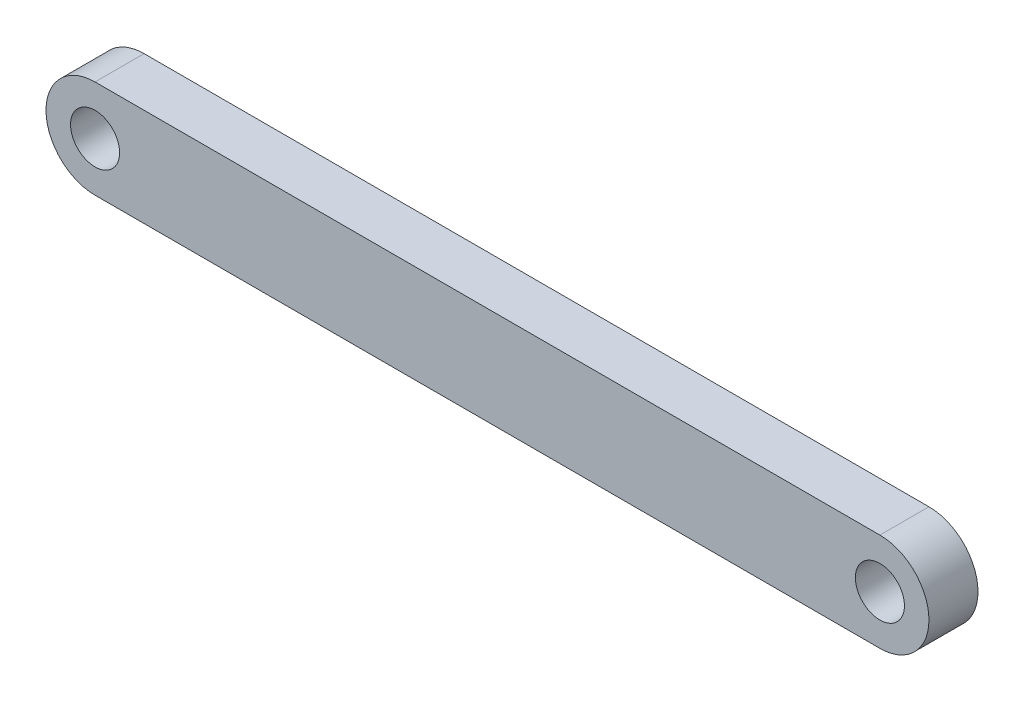
ISO-10303-21;
HEADER;
FILE_DESCRIPTION(('STEP AP214'),'2;1');
FILE_NAME('part.step','',(''),(''),'','','');
FILE_SCHEMA(('AUTOMOTIVE_DESIGN { 1 0 10303 214 1 1 1 1 }'));
ENDSEC;
DATA;
#1=APPLICATION_CONTEXT('core data for automotive mechanical design processes');
#2=APPLICATION_PROTOCOL_DEFINITION('international standard','automotive_design',2000,#1);
#3=PRODUCT_CONTEXT('',#1,'mechanical');
#4=PRODUCT('Part','Part','',(#3));
#5=PRODUCT_RELATED_PRODUCT_CATEGORY('part','',(#4));
#6=PRODUCT_DEFINITION_FORMATION('','',#4);
#7=PRODUCT_DEFINITION_CONTEXT('part definition',#1,'design');
#8=PRODUCT_DEFINITION('design','',#6,#7);
#9=PRODUCT_DEFINITION_SHAPE('','',#8);
#10=(LENGTH_UNIT() NAMED_UNIT(*) SI_UNIT(.MILLI.,.METRE.));
#11=(NAMED_UNIT(*) PLANE_ANGLE_UNIT() SI_UNIT($,.RADIAN.));
#12=(NAMED_UNIT(*) SI_UNIT($,.STERADIAN.) SOLID_ANGLE_UNIT());
#13=UNCERTAINTY_MEASURE_WITH_UNIT(LENGTH_MEASURE(1.E-05),#10,'distance_accuracy_value','');
#14=(GEOMETRIC_REPRESENTATION_CONTEXT(3) GLOBAL_UNCERTAINTY_ASSIGNED_CONTEXT((#13)) GLOBAL_UNIT_ASSIGNED_CONTEXT((#10,
#11,#12)) REPRESENTATION_CONTEXT('',''));
#15=CARTESIAN_POINT('',(0.,0.,0.));
#16=DIRECTION('',(0.,0.,1.));
#17=DIRECTION('',(1.,0.,0.));
#18=AXIS2_PLACEMENT_3D('',#15,#16,#17);
#19=CARTESIAN_POINT('',(-47.9644500235423,0.,5.));
#20=DIRECTION('',(0.,0.,1.));
#21=DIRECTION('',(1.,0.,0.));
#22=AXIS2_PLACEMENT_3D('',#19,#20,#21);
#23=PLANE('',#22);
#24=CARTESIAN_POINT('',(-47.9644500235423,0.,5.));
#25=DIRECTION('',(0.,0.,1.));
#26=DIRECTION('',(1.,0.,0.));
#27=AXIS2_PLACEMENT_3D('',#24,#25,#26);
#28=CIRCLE('',#27,2.5);
#29=CARTESIAN_POINT('',(-45.4644500235423,0.,5.));
#30=VERTEX_POINT('',#29);
#31=EDGE_CURVE('E112',#30,#30,#28,.T.);
#32=ORIENTED_EDGE('',*,*,#31,.F.);
#33=EDGE_LOOP('',(#32));
#34=FACE_BOUND('',#33,.T.);
#35=CARTESIAN_POINT('',(-47.9644500235423,0.,5.));
#36=DIRECTION('',(0.,0.,1.));
#37=DIRECTION('',(1.,0.,0.));
#38=AXIS2_PLACEMENT_3D('',#35,#36,#37);
#39=CIRCLE('',#38,5.);
#40=CARTESIAN_POINT('',(-47.9644500235423,5.,5.));
#41=VERTEX_POINT('',#40);
#42=CARTESIAN_POINT('',(-47.9644500235423,-5.,5.));
#43=VERTEX_POINT('',#42);
#44=EDGE_CURVE('E92',#41,#43,#39,.T.);
#45=ORIENTED_EDGE('',*,*,#44,.T.);
#46=DIRECTION('',(1.,0.,0.));
#47=VECTOR('',#46,1.);
#48=CARTESIAN_POINT('',(-47.9644500235423,-5.,5.));
#49=LINE('',#48,#47);
#50=CARTESIAN_POINT('',(32.0355499764577,-5.,5.));
#51=VERTEX_POINT('',#50);
#52=EDGE_CURVE('E87',#43,#51,#49,.T.);
#53=ORIENTED_EDGE('',*,*,#52,.T.);
#54=CARTESIAN_POINT('',(32.0355499764577,0.,5.));
#55=DIRECTION('',(0.,0.,1.));
#56=DIRECTION('',(1.,0.,0.));
#57=AXIS2_PLACEMENT_3D('',#54,#55,#56);
#58=CIRCLE('',#57,5.);
#59=CARTESIAN_POINT('',(32.0355499764577,5.,5.));
#60=VERTEX_POINT('',#59);
#61=EDGE_CURVE('E90',#51,#60,#58,.T.);
#62=ORIENTED_EDGE('',*,*,#61,.T.);
#63=DIRECTION('',(-1.,0.,0.));
#64=VECTOR('',#63,1.);
#65=CARTESIAN_POINT('',(-47.9644500235423,5.,5.));
#66=LINE('',#65,#64);
#67=EDGE_CURVE('E57',#60,#41,#66,.T.);
#68=ORIENTED_EDGE('',*,*,#67,.T.);
#69=EDGE_LOOP('',(#45,#53,#62,#68));
#70=FACE_BOUND('',#69,.T.);
#71=CARTESIAN_POINT('',(32.0355499764577,0.,5.));
#72=DIRECTION('',(0.,0.,1.));
#73=DIRECTION('',(1.,0.,0.));
#74=AXIS2_PLACEMENT_3D('',#71,#72,#73);
#75=CIRCLE('',#74,2.5);
#76=CARTESIAN_POINT('',(34.5355499764577,0.,5.));
#77=VERTEX_POINT('',#76);
#78=EDGE_CURVE('E134',#77,#77,#75,.T.);
#79=ORIENTED_EDGE('',*,*,#78,.F.);
#80=EDGE_LOOP('',(#79));
#81=FACE_BOUND('',#80,.T.);
#82=ADVANCED_FACE('F39',(#34,#70,#81),#23,.T.);
#83=CARTESIAN_POINT('',(-47.9644500235423,0.,0.));
#84=DIRECTION('',(0.,0.,1.));
#85=DIRECTION('',(1.,0.,0.));
#86=AXIS2_PLACEMENT_3D('',#83,#84,#85);
#87=PLANE('',#86);
#88=CARTESIAN_POINT('',(-47.9644500235423,0.,0.));
#89=DIRECTION('',(0.,0.,1.));
#90=DIRECTION('',(1.,0.,0.));
#91=AXIS2_PLACEMENT_3D('',#88,#89,#90);
#92=CIRCLE('',#91,5.);
#93=CARTESIAN_POINT('',(-47.9644500235423,5.,0.));
#94=VERTEX_POINT('',#93);
#95=CARTESIAN_POINT('',(-47.9644500235423,-5.,0.));
#96=VERTEX_POINT('',#95);
#97=EDGE_CURVE('E108',#94,#96,#92,.T.);
#98=ORIENTED_EDGE('',*,*,#97,.F.);
#99=DIRECTION('',(-1.,0.,0.));
#100=VECTOR('',#99,1.);
#101=CARTESIAN_POINT('',(-47.9644500235423,5.,0.));
#102=LINE('',#101,#100);
#103=CARTESIAN_POINT('',(32.0355499764577,5.,0.));
#104=VERTEX_POINT('',#103);
#105=EDGE_CURVE('E80',#104,#94,#102,.T.);
#106=ORIENTED_EDGE('',*,*,#105,.F.);
#107=CARTESIAN_POINT('',(32.0355499764577,0.,0.));
#108=DIRECTION('',(0.,0.,1.));
#109=DIRECTION('',(1.,0.,0.));
#110=AXIS2_PLACEMENT_3D('',#107,#108,#109);
#111=CIRCLE('',#110,5.);
#112=CARTESIAN_POINT('',(32.0355499764577,-5.,0.));
#113=VERTEX_POINT('',#112);
#114=EDGE_CURVE('E74',#113,#104,#111,.T.);
#115=ORIENTED_EDGE('',*,*,#114,.F.);
#116=DIRECTION('',(1.,0.,0.));
#117=VECTOR('',#116,1.);
#118=CARTESIAN_POINT('',(-47.9644500235423,-5.,0.));
#119=LINE('',#118,#117);
#120=EDGE_CURVE('E97',#96,#113,#119,.T.);
#121=ORIENTED_EDGE('',*,*,#120,.F.);
#122=EDGE_LOOP('',(#98,#106,#115,#121));
#123=FACE_BOUND('',#122,.T.);
#124=CARTESIAN_POINT('',(-47.9644500235423,0.,0.));
#125=DIRECTION('',(0.,0.,1.));
#126=DIRECTION('',(1.,0.,0.));
#127=AXIS2_PLACEMENT_3D('',#124,#125,#126);
#128=CIRCLE('',#127,2.5);
#129=CARTESIAN_POINT('',(-45.4644500235423,0.,0.));
#130=VERTEX_POINT('',#129);
#131=EDGE_CURVE('E130',#130,#130,#128,.T.);
#132=ORIENTED_EDGE('',*,*,#131,.T.);
#133=EDGE_LOOP('',(#132));
#134=FACE_BOUND('',#133,.T.);
#135=CARTESIAN_POINT('',(32.0355499764577,0.,0.));
#136=DIRECTION('',(0.,0.,1.));
#137=DIRECTION('',(1.,0.,0.));
#138=AXIS2_PLACEMENT_3D('',#135,#136,#137);
#139=CIRCLE('',#138,2.5);
#140=CARTESIAN_POINT('',(34.5355499764577,0.,0.));
#141=VERTEX_POINT('',#140);
#142=EDGE_CURVE('E138',#141,#141,#139,.T.);
#143=ORIENTED_EDGE('',*,*,#142,.T.);
#144=EDGE_LOOP('',(#143));
#145=FACE_BOUND('',#144,.T.);
#146=ADVANCED_FACE('F125',(#123,#134,#145),#87,.F.);
#147=CARTESIAN_POINT('',(-47.9644500235423,0.,5.));
#148=DIRECTION('',(0.,0.,-1.));
#149=DIRECTION('',(-1.,0.,0.));
#150=AXIS2_PLACEMENT_3D('',#147,#148,#149);
#151=CYLINDRICAL_SURFACE('',#150,5.);
#152=ORIENTED_EDGE('',*,*,#97,.T.);
#153=DIRECTION('',(0.,0.,-1.));
#154=VECTOR('',#153,1.);
#155=CARTESIAN_POINT('',(-47.9644500235423,-5.,5.));
#156=LINE('',#155,#154);
#157=EDGE_CURVE('E11',#43,#96,#156,.T.);
#158=ORIENTED_EDGE('',*,*,#157,.F.);
#159=ORIENTED_EDGE('',*,*,#44,.F.);
#160=DIRECTION('',(0.,0.,-1.));
#161=VECTOR('',#160,1.);
#162=CARTESIAN_POINT('',(-47.9644500235423,5.,5.));
#163=LINE('',#162,#161);
#164=EDGE_CURVE('E104',#41,#94,#163,.T.);
#165=ORIENTED_EDGE('',*,*,#164,.T.);
#166=EDGE_LOOP('',(#152,#158,#159,#165));
#167=FACE_BOUND('',#166,.T.);
#168=ADVANCED_FACE('F41',(#167),#151,.T.);
#169=CARTESIAN_POINT('',(-47.9644500235423,-5.,5.));
#170=DIRECTION('',(0.,1.,0.));
#171=DIRECTION('',(0.,0.,1.));
#172=AXIS2_PLACEMENT_3D('',#169,#170,#171);
#173=PLANE('',#172);
#174=ORIENTED_EDGE('',*,*,#120,.T.);
#175=DIRECTION('',(0.,0.,-1.));
#176=VECTOR('',#175,1.);
#177=CARTESIAN_POINT('',(32.0355499764577,-5.,5.));
#178=LINE('',#177,#176);
#179=EDGE_CURVE('E49',#51,#113,#178,.T.);
#180=ORIENTED_EDGE('',*,*,#179,.F.);
#181=ORIENTED_EDGE('',*,*,#52,.F.);
#182=ORIENTED_EDGE('',*,*,#157,.T.);
#183=EDGE_LOOP('',(#174,#180,#181,#182));
#184=FACE_BOUND('',#183,.T.);
#185=ADVANCED_FACE('F96',(#184),#173,.F.);
#186=CARTESIAN_POINT('',(32.0355499764577,0.,5.));
#187=DIRECTION('',(0.,0.,-1.));
#188=DIRECTION('',(-1.,0.,0.));
#189=AXIS2_PLACEMENT_3D('',#186,#187,#188);
#190=CYLINDRICAL_SURFACE('',#189,5.);
#191=ORIENTED_EDGE('',*,*,#114,.T.);
#192=DIRECTION('',(0.,0.,-1.));
#193=VECTOR('',#192,1.);
#194=CARTESIAN_POINT('',(32.0355499764577,5.,5.));
#195=LINE('',#194,#193);
#196=EDGE_CURVE('E99',#60,#104,#195,.T.);
#197=ORIENTED_EDGE('',*,*,#196,.F.);
#198=ORIENTED_EDGE('',*,*,#61,.F.);
#199=ORIENTED_EDGE('',*,*,#179,.T.);
#200=EDGE_LOOP('',(#191,#197,#198,#199));
#201=FACE_BOUND('',#200,.T.);
#202=ADVANCED_FACE('F100',(#201),#190,.T.);
#203=CARTESIAN_POINT('',(-47.9644500235423,5.,5.));
#204=DIRECTION('',(0.,-1.,0.));
#205=DIRECTION('',(0.,0.,-1.));
#206=AXIS2_PLACEMENT_3D('',#203,#204,#205);
#207=PLANE('',#206);
#208=ORIENTED_EDGE('',*,*,#105,.T.);
#209=ORIENTED_EDGE('',*,*,#164,.F.);
#210=ORIENTED_EDGE('',*,*,#67,.F.);
#211=ORIENTED_EDGE('',*,*,#196,.T.);
#212=EDGE_LOOP('',(#208,#209,#210,#211));
#213=FACE_BOUND('',#212,.T.);
#214=ADVANCED_FACE('F122',(#213),#207,.F.);
#215=CARTESIAN_POINT('',(-47.9644500235423,0.,5.));
#216=DIRECTION('',(0.,0.,-1.));
#217=DIRECTION('',(-1.,0.,0.));
#218=AXIS2_PLACEMENT_3D('',#215,#216,#217);
#219=CYLINDRICAL_SURFACE('',#218,2.5);
#220=ORIENTED_EDGE('',*,*,#31,.T.);
#221=EDGE_LOOP('',(#220));
#222=FACE_BOUND('',#221,.T.);
#223=ORIENTED_EDGE('',*,*,#131,.F.);
#224=EDGE_LOOP('',(#223));
#225=FACE_BOUND('',#224,.T.);
#226=ADVANCED_FACE('F157',(#222,#225),#219,.F.);
#227=CARTESIAN_POINT('',(32.0355499764577,0.,5.));
#228=DIRECTION('',(0.,0.,-1.));
#229=DIRECTION('',(-1.,0.,0.));
#230=AXIS2_PLACEMENT_3D('',#227,#228,#229);
#231=CYLINDRICAL_SURFACE('',#230,2.5);
#232=ORIENTED_EDGE('',*,*,#78,.T.);
#233=EDGE_LOOP('',(#232));
#234=FACE_BOUND('',#233,.T.);
#235=ORIENTED_EDGE('',*,*,#142,.F.);
#236=EDGE_LOOP('',(#235));
#237=FACE_BOUND('',#236,.T.);
#238=ADVANCED_FACE('F146',(#234,#237),#231,.F.);
#239=CLOSED_SHELL('',(#82,#146,#168,#185,#202,#214,#226,#238));
#240=MANIFOLD_SOLID_BREP('B2',#239);
#241=ADVANCED_BREP_SHAPE_REPRESENTATION('',(#18,#240),#14);
#242=SHAPE_DEFINITION_REPRESENTATION(#9,#241);
ENDSEC;
END-ISO-10303-21;
